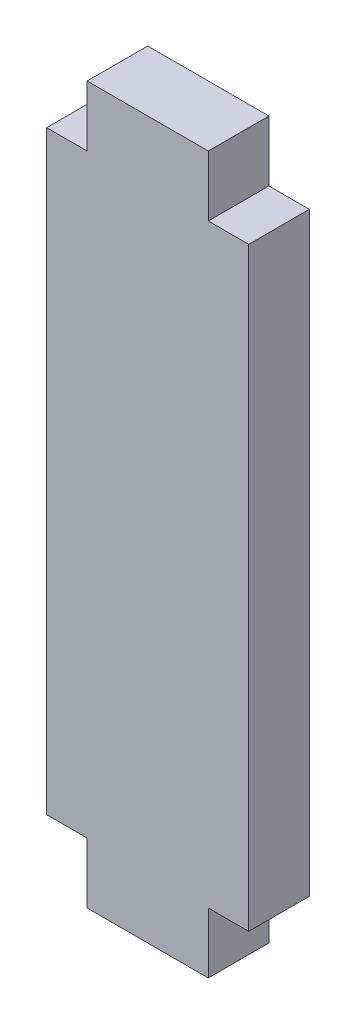
ISO-10303-21;
HEADER;
FILE_DESCRIPTION(('STEP AP214'),'2;1');
FILE_NAME('part.step','',(''),(''),'','','');
FILE_SCHEMA(('AUTOMOTIVE_DESIGN { 1 0 10303 214 1 1 1 1 }'));
ENDSEC;
DATA;
#1=APPLICATION_CONTEXT('core data for automotive mechanical design processes');
#2=APPLICATION_PROTOCOL_DEFINITION('international standard','automotive_design',2000,#1);
#3=PRODUCT_CONTEXT('',#1,'mechanical');
#4=PRODUCT('Part','Part','',(#3));
#5=PRODUCT_RELATED_PRODUCT_CATEGORY('part','',(#4));
#6=PRODUCT_DEFINITION_FORMATION('','',#4);
#7=PRODUCT_DEFINITION_CONTEXT('part definition',#1,'design');
#8=PRODUCT_DEFINITION('design','',#6,#7);
#9=PRODUCT_DEFINITION_SHAPE('','',#8);
#10=(LENGTH_UNIT() NAMED_UNIT(*) SI_UNIT(.MILLI.,.METRE.));
#11=(NAMED_UNIT(*) PLANE_ANGLE_UNIT() SI_UNIT($,.RADIAN.));
#12=(NAMED_UNIT(*) SI_UNIT($,.STERADIAN.) SOLID_ANGLE_UNIT());
#13=UNCERTAINTY_MEASURE_WITH_UNIT(LENGTH_MEASURE(1.E-05),#10,'distance_accuracy_value','');
#14=(GEOMETRIC_REPRESENTATION_CONTEXT(3) GLOBAL_UNCERTAINTY_ASSIGNED_CONTEXT((#13)) GLOBAL_UNIT_ASSIGNED_CONTEXT((#10,
#11,#12)) REPRESENTATION_CONTEXT('',''));
#15=CARTESIAN_POINT('',(0.,0.,0.));
#16=DIRECTION('',(0.,0.,1.));
#17=DIRECTION('',(1.,0.,0.));
#18=AXIS2_PLACEMENT_3D('',#15,#16,#17);
#19=CARTESIAN_POINT('',(-5.,0.,3.));
#20=DIRECTION('',(-1.,0.,0.));
#21=DIRECTION('',(0.,-1.,0.));
#22=AXIS2_PLACEMENT_3D('',#19,#20,#21);
#23=PLANE('',#22);
#24=DIRECTION('',(0.,1.,0.));
#25=VECTOR('',#24,1.);
#26=CARTESIAN_POINT('',(-5.,0.,0.));
#27=LINE('',#26,#25);
#28=CARTESIAN_POINT('',(-5.,-14.725,0.));
#29=VERTEX_POINT('',#28);
#30=CARTESIAN_POINT('',(-5.,14.725,0.));
#31=VERTEX_POINT('',#30);
#32=EDGE_CURVE('E158',#29,#31,#27,.T.);
#33=ORIENTED_EDGE('',*,*,#32,.F.);
#34=DIRECTION('',(0.,0.,-1.));
#35=VECTOR('',#34,1.);
#36=CARTESIAN_POINT('',(-5.,-14.725,3.));
#37=LINE('',#36,#35);
#38=CARTESIAN_POINT('',(-5.,-14.725,3.));
#39=VERTEX_POINT('',#38);
#40=EDGE_CURVE('E11',#39,#29,#37,.T.);
#41=ORIENTED_EDGE('',*,*,#40,.F.);
#42=DIRECTION('',(0.,1.,0.));
#43=VECTOR('',#42,1.);
#44=CARTESIAN_POINT('',(-5.,0.,3.));
#45=LINE('',#44,#43);
#46=CARTESIAN_POINT('',(-5.,14.725,3.));
#47=VERTEX_POINT('',#46);
#48=EDGE_CURVE('E216',#39,#47,#45,.T.);
#49=ORIENTED_EDGE('',*,*,#48,.T.);
#50=DIRECTION('',(0.,0.,-1.));
#51=VECTOR('',#50,1.);
#52=CARTESIAN_POINT('',(-5.,14.725,3.));
#53=LINE('',#52,#51);
#54=EDGE_CURVE('E103',#47,#31,#53,.T.);
#55=ORIENTED_EDGE('',*,*,#54,.T.);
#56=EDGE_LOOP('',(#33,#41,#49,#55));
#57=FACE_BOUND('',#56,.T.);
#58=ADVANCED_FACE('F41',(#57),#23,.T.);
#59=CARTESIAN_POINT('',(0.,-14.725,3.));
#60=DIRECTION('',(0.,-1.,0.));
#61=DIRECTION('',(1.,0.,0.));
#62=AXIS2_PLACEMENT_3D('',#59,#60,#61);
#63=PLANE('',#62);
#64=DIRECTION('',(-1.,0.,0.));
#65=VECTOR('',#64,1.);
#66=CARTESIAN_POINT('',(0.,-14.725,0.));
#67=LINE('',#66,#65);
#68=CARTESIAN_POINT('',(-3.,-14.725,0.));
#69=VERTEX_POINT('',#68);
#70=EDGE_CURVE('E161',#69,#29,#67,.T.);
#71=ORIENTED_EDGE('',*,*,#70,.F.);
#72=DIRECTION('',(0.,0.,-1.));
#73=VECTOR('',#72,1.);
#74=CARTESIAN_POINT('',(-3.,-14.725,3.));
#75=LINE('',#74,#73);
#76=CARTESIAN_POINT('',(-3.,-14.725,3.));
#77=VERTEX_POINT('',#76);
#78=EDGE_CURVE('E49',#77,#69,#75,.T.);
#79=ORIENTED_EDGE('',*,*,#78,.F.);
#80=DIRECTION('',(-1.,0.,0.));
#81=VECTOR('',#80,1.);
#82=CARTESIAN_POINT('',(0.,-14.725,3.));
#83=LINE('',#82,#81);
#84=EDGE_CURVE('E215',#77,#39,#83,.T.);
#85=ORIENTED_EDGE('',*,*,#84,.T.);
#86=ORIENTED_EDGE('',*,*,#40,.T.);
#87=EDGE_LOOP('',(#71,#79,#85,#86));
#88=FACE_BOUND('',#87,.T.);
#89=ADVANCED_FACE('F214',(#88),#63,.T.);
#90=CARTESIAN_POINT('',(-3.,0.,3.));
#91=DIRECTION('',(1.,0.,0.));
#92=DIRECTION('',(0.,0.,-1.));
#93=AXIS2_PLACEMENT_3D('',#90,#91,#92);
#94=PLANE('',#93);
#95=DIRECTION('',(0.,-1.,0.));
#96=VECTOR('',#95,1.);
#97=CARTESIAN_POINT('',(-3.,0.,0.));
#98=LINE('',#97,#96);
#99=CARTESIAN_POINT('',(-3.,-17.725,0.));
#100=VERTEX_POINT('',#99);
#101=EDGE_CURVE('E164',#69,#100,#98,.T.);
#102=ORIENTED_EDGE('',*,*,#101,.T.);
#103=DIRECTION('',(0.,0.,-1.));
#104=VECTOR('',#103,1.);
#105=CARTESIAN_POINT('',(-3.,-17.725,3.));
#106=LINE('',#105,#104);
#107=CARTESIAN_POINT('',(-3.,-17.725,3.));
#108=VERTEX_POINT('',#107);
#109=EDGE_CURVE('E199',#108,#100,#106,.T.);
#110=ORIENTED_EDGE('',*,*,#109,.F.);
#111=DIRECTION('',(0.,-1.,0.));
#112=VECTOR('',#111,1.);
#113=CARTESIAN_POINT('',(-3.,0.,3.));
#114=LINE('',#113,#112);
#115=EDGE_CURVE('E206',#77,#108,#114,.T.);
#116=ORIENTED_EDGE('',*,*,#115,.F.);
#117=ORIENTED_EDGE('',*,*,#78,.T.);
#118=EDGE_LOOP('',(#102,#110,#116,#117));
#119=FACE_BOUND('',#118,.T.);
#120=ADVANCED_FACE('F204',(#119),#94,.F.);
#121=CARTESIAN_POINT('',(0.,-17.725,3.));
#122=DIRECTION('',(0.,1.,0.));
#123=DIRECTION('',(0.,0.,1.));
#124=AXIS2_PLACEMENT_3D('',#121,#122,#123);
#125=PLANE('',#124);
#126=DIRECTION('',(1.,0.,0.));
#127=VECTOR('',#126,1.);
#128=CARTESIAN_POINT('',(0.,-17.725,0.));
#129=LINE('',#128,#127);
#130=CARTESIAN_POINT('',(3.,-17.725,0.));
#131=VERTEX_POINT('',#130);
#132=EDGE_CURVE('E167',#100,#131,#129,.T.);
#133=ORIENTED_EDGE('',*,*,#132,.T.);
#134=DIRECTION('',(0.,0.,-1.));
#135=VECTOR('',#134,1.);
#136=CARTESIAN_POINT('',(3.,-17.725,3.));
#137=LINE('',#136,#135);
#138=CARTESIAN_POINT('',(3.,-17.725,3.));
#139=VERTEX_POINT('',#138);
#140=EDGE_CURVE('E197',#139,#131,#137,.T.);
#141=ORIENTED_EDGE('',*,*,#140,.F.);
#142=DIRECTION('',(1.,0.,0.));
#143=VECTOR('',#142,1.);
#144=CARTESIAN_POINT('',(0.,-17.725,3.));
#145=LINE('',#144,#143);
#146=EDGE_CURVE('E222',#108,#139,#145,.T.);
#147=ORIENTED_EDGE('',*,*,#146,.F.);
#148=ORIENTED_EDGE('',*,*,#109,.T.);
#149=EDGE_LOOP('',(#133,#141,#147,#148));
#150=FACE_BOUND('',#149,.T.);
#151=ADVANCED_FACE('F253',(#150),#125,.F.);
#152=CARTESIAN_POINT('',(3.,0.,3.));
#153=DIRECTION('',(1.,0.,0.));
#154=DIRECTION('',(0.,1.,0.));
#155=AXIS2_PLACEMENT_3D('',#152,#153,#154);
#156=PLANE('',#155);
#157=DIRECTION('',(0.,-1.,0.));
#158=VECTOR('',#157,1.);
#159=CARTESIAN_POINT('',(3.,0.,0.));
#160=LINE('',#159,#158);
#161=CARTESIAN_POINT('',(3.,-14.725,0.));
#162=VERTEX_POINT('',#161);
#163=EDGE_CURVE('E170',#162,#131,#160,.T.);
#164=ORIENTED_EDGE('',*,*,#163,.F.);
#165=DIRECTION('',(0.,0.,-1.));
#166=VECTOR('',#165,1.);
#167=CARTESIAN_POINT('',(3.,-14.725,3.));
#168=LINE('',#167,#166);
#169=CARTESIAN_POINT('',(3.,-14.725,3.));
#170=VERTEX_POINT('',#169);
#171=EDGE_CURVE('E195',#170,#162,#168,.T.);
#172=ORIENTED_EDGE('',*,*,#171,.F.);
#173=DIRECTION('',(0.,-1.,0.));
#174=VECTOR('',#173,1.);
#175=CARTESIAN_POINT('',(3.,0.,3.));
#176=LINE('',#175,#174);
#177=EDGE_CURVE('E224',#170,#139,#176,.T.);
#178=ORIENTED_EDGE('',*,*,#177,.T.);
#179=ORIENTED_EDGE('',*,*,#140,.T.);
#180=EDGE_LOOP('',(#164,#172,#178,#179));
#181=FACE_BOUND('',#180,.T.);
#182=ADVANCED_FACE('F249',(#181),#156,.T.);
#183=CARTESIAN_POINT('',(5.,-14.725,0.));
#184=VERTEX_POINT('',#183);
#185=EDGE_CURVE('E165',#184,#162,#67,.T.);
#186=ORIENTED_EDGE('',*,*,#185,.F.);
#187=DIRECTION('',(0.,0.,-1.));
#188=VECTOR('',#187,1.);
#189=CARTESIAN_POINT('',(5.,-14.725,3.));
#190=LINE('',#189,#188);
#191=CARTESIAN_POINT('',(5.,-14.725,3.));
#192=VERTEX_POINT('',#191);
#193=EDGE_CURVE('E193',#192,#184,#190,.T.);
#194=ORIENTED_EDGE('',*,*,#193,.F.);
#195=EDGE_CURVE('E219',#192,#170,#83,.T.);
#196=ORIENTED_EDGE('',*,*,#195,.T.);
#197=ORIENTED_EDGE('',*,*,#171,.T.);
#198=EDGE_LOOP('',(#186,#194,#196,#197));
#199=FACE_BOUND('',#198,.T.);
#200=ADVANCED_FACE('F244',(#199),#63,.T.);
#201=CARTESIAN_POINT('',(5.,0.,3.));
#202=DIRECTION('',(-1.,0.,0.));
#203=DIRECTION('',(0.,-1.,0.));
#204=AXIS2_PLACEMENT_3D('',#201,#202,#203);
#205=PLANE('',#204);
#206=DIRECTION('',(0.,1.,0.));
#207=VECTOR('',#206,1.);
#208=CARTESIAN_POINT('',(5.,0.,0.));
#209=LINE('',#208,#207);
#210=CARTESIAN_POINT('',(5.,14.725,0.));
#211=VERTEX_POINT('',#210);
#212=EDGE_CURVE('E173',#184,#211,#209,.T.);
#213=ORIENTED_EDGE('',*,*,#212,.T.);
#214=DIRECTION('',(0.,0.,-1.));
#215=VECTOR('',#214,1.);
#216=CARTESIAN_POINT('',(5.,14.725,3.));
#217=LINE('',#216,#215);
#218=CARTESIAN_POINT('',(5.,14.725,3.));
#219=VERTEX_POINT('',#218);
#220=EDGE_CURVE('E190',#219,#211,#217,.T.);
#221=ORIENTED_EDGE('',*,*,#220,.F.);
#222=DIRECTION('',(0.,1.,0.));
#223=VECTOR('',#222,1.);
#224=CARTESIAN_POINT('',(5.,0.,3.));
#225=LINE('',#224,#223);
#226=EDGE_CURVE('E227',#192,#219,#225,.T.);
#227=ORIENTED_EDGE('',*,*,#226,.F.);
#228=ORIENTED_EDGE('',*,*,#193,.T.);
#229=EDGE_LOOP('',(#213,#221,#227,#228));
#230=FACE_BOUND('',#229,.T.);
#231=ADVANCED_FACE('F270',(#230),#205,.F.);
#232=CARTESIAN_POINT('',(0.,14.725,3.));
#233=DIRECTION('',(0.,-1.,0.));
#234=DIRECTION('',(1.,0.,0.));
#235=AXIS2_PLACEMENT_3D('',#232,#233,#234);
#236=PLANE('',#235);
#237=DIRECTION('',(-1.,0.,0.));
#238=VECTOR('',#237,1.);
#239=CARTESIAN_POINT('',(0.,14.725,0.));
#240=LINE('',#239,#238);
#241=CARTESIAN_POINT('',(3.,14.725,0.));
#242=VERTEX_POINT('',#241);
#243=EDGE_CURVE('E175',#211,#242,#240,.T.);
#244=ORIENTED_EDGE('',*,*,#243,.T.);
#245=DIRECTION('',(0.,0.,-1.));
#246=VECTOR('',#245,1.);
#247=CARTESIAN_POINT('',(3.,14.725,3.));
#248=LINE('',#247,#246);
#249=CARTESIAN_POINT('',(3.,14.725,3.));
#250=VERTEX_POINT('',#249);
#251=EDGE_CURVE('E187',#250,#242,#248,.T.);
#252=ORIENTED_EDGE('',*,*,#251,.F.);
#253=DIRECTION('',(-1.,0.,0.));
#254=VECTOR('',#253,1.);
#255=CARTESIAN_POINT('',(0.,14.725,3.));
#256=LINE('',#255,#254);
#257=EDGE_CURVE('E155',#219,#250,#256,.T.);
#258=ORIENTED_EDGE('',*,*,#257,.F.);
#259=ORIENTED_EDGE('',*,*,#220,.T.);
#260=EDGE_LOOP('',(#244,#252,#258,#259));
#261=FACE_BOUND('',#260,.T.);
#262=ADVANCED_FACE('F234',(#261),#236,.F.);
#263=CARTESIAN_POINT('',(3.,0.,3.));
#264=DIRECTION('',(-1.,0.,0.));
#265=DIRECTION('',(0.,-1.,0.));
#266=AXIS2_PLACEMENT_3D('',#263,#264,#265);
#267=PLANE('',#266);
#268=DIRECTION('',(0.,1.,0.));
#269=VECTOR('',#268,1.);
#270=CARTESIAN_POINT('',(3.,0.,0.));
#271=LINE('',#270,#269);
#272=CARTESIAN_POINT('',(3.,17.725,0.));
#273=VERTEX_POINT('',#272);
#274=EDGE_CURVE('E177',#242,#273,#271,.T.);
#275=ORIENTED_EDGE('',*,*,#274,.T.);
#276=DIRECTION('',(0.,0.,-1.));
#277=VECTOR('',#276,1.);
#278=CARTESIAN_POINT('',(3.,17.725,3.));
#279=LINE('',#278,#277);
#280=CARTESIAN_POINT('',(3.,17.725,3.));
#281=VERTEX_POINT('',#280);
#282=EDGE_CURVE('E144',#281,#273,#279,.T.);
#283=ORIENTED_EDGE('',*,*,#282,.F.);
#284=DIRECTION('',(0.,1.,0.));
#285=VECTOR('',#284,1.);
#286=CARTESIAN_POINT('',(3.,0.,3.));
#287=LINE('',#286,#285);
#288=EDGE_CURVE('E149',#250,#281,#287,.T.);
#289=ORIENTED_EDGE('',*,*,#288,.F.);
#290=ORIENTED_EDGE('',*,*,#251,.T.);
#291=EDGE_LOOP('',(#275,#283,#289,#290));
#292=FACE_BOUND('',#291,.T.);
#293=ADVANCED_FACE('F238',(#292),#267,.F.);
#294=CARTESIAN_POINT('',(0.,17.725,3.));
#295=DIRECTION('',(0.,1.,0.));
#296=DIRECTION('',(-1.,0.,0.));
#297=AXIS2_PLACEMENT_3D('',#294,#295,#296);
#298=PLANE('',#297);
#299=DIRECTION('',(1.,0.,0.));
#300=VECTOR('',#299,1.);
#301=CARTESIAN_POINT('',(0.,17.725,0.));
#302=LINE('',#301,#300);
#303=CARTESIAN_POINT('',(-3.,17.725,0.));
#304=VERTEX_POINT('',#303);
#305=EDGE_CURVE('E139',#304,#273,#302,.T.);
#306=ORIENTED_EDGE('',*,*,#305,.F.);
#307=DIRECTION('',(0.,0.,-1.));
#308=VECTOR('',#307,1.);
#309=CARTESIAN_POINT('',(-3.,17.725,3.));
#310=LINE('',#309,#308);
#311=CARTESIAN_POINT('',(-3.,17.725,3.));
#312=VERTEX_POINT('',#311);
#313=EDGE_CURVE('E134',#312,#304,#310,.T.);
#314=ORIENTED_EDGE('',*,*,#313,.F.);
#315=DIRECTION('',(1.,0.,0.));
#316=VECTOR('',#315,1.);
#317=CARTESIAN_POINT('',(0.,17.725,3.));
#318=LINE('',#317,#316);
#319=EDGE_CURVE('E137',#312,#281,#318,.T.);
#320=ORIENTED_EDGE('',*,*,#319,.T.);
#321=ORIENTED_EDGE('',*,*,#282,.T.);
#322=EDGE_LOOP('',(#306,#314,#320,#321));
#323=FACE_BOUND('',#322,.T.);
#324=ADVANCED_FACE('F136',(#323),#298,.T.);
#325=CARTESIAN_POINT('',(-3.,0.,3.));
#326=DIRECTION('',(-1.,0.,0.));
#327=DIRECTION('',(0.,0.,1.));
#328=AXIS2_PLACEMENT_3D('',#325,#326,#327);
#329=PLANE('',#328);
#330=DIRECTION('',(0.,1.,0.));
#331=VECTOR('',#330,1.);
#332=CARTESIAN_POINT('',(-3.,0.,0.));
#333=LINE('',#332,#331);
#334=CARTESIAN_POINT('',(-3.,14.725,0.));
#335=VERTEX_POINT('',#334);
#336=EDGE_CURVE('E182',#335,#304,#333,.T.);
#337=ORIENTED_EDGE('',*,*,#336,.F.);
#338=DIRECTION('',(0.,0.,-1.));
#339=VECTOR('',#338,1.);
#340=CARTESIAN_POINT('',(-3.,14.725,3.));
#341=LINE('',#340,#339);
#342=CARTESIAN_POINT('',(-3.,14.725,3.));
#343=VERTEX_POINT('',#342);
#344=EDGE_CURVE('E96',#343,#335,#341,.T.);
#345=ORIENTED_EDGE('',*,*,#344,.F.);
#346=DIRECTION('',(0.,1.,0.));
#347=VECTOR('',#346,1.);
#348=CARTESIAN_POINT('',(-3.,0.,3.));
#349=LINE('',#348,#347);
#350=EDGE_CURVE('E147',#343,#312,#349,.T.);
#351=ORIENTED_EDGE('',*,*,#350,.T.);
#352=ORIENTED_EDGE('',*,*,#313,.T.);
#353=EDGE_LOOP('',(#337,#345,#351,#352));
#354=FACE_BOUND('',#353,.T.);
#355=ADVANCED_FACE('F152',(#354),#329,.T.);
#356=EDGE_CURVE('E178',#335,#31,#240,.T.);
#357=ORIENTED_EDGE('',*,*,#356,.T.);
#358=ORIENTED_EDGE('',*,*,#54,.F.);
#359=EDGE_CURVE('E57',#343,#47,#256,.T.);
#360=ORIENTED_EDGE('',*,*,#359,.F.);
#361=ORIENTED_EDGE('',*,*,#344,.T.);
#362=EDGE_LOOP('',(#357,#358,#360,#361));
#363=FACE_BOUND('',#362,.T.);
#364=ADVANCED_FACE('F278',(#363),#236,.F.);
#365=CARTESIAN_POINT('',(0.,0.,3.));
#366=DIRECTION('',(0.,0.,1.));
#367=DIRECTION('',(1.,0.,0.));
#368=AXIS2_PLACEMENT_3D('',#365,#366,#367);
#369=PLANE('',#368);
#370=ORIENTED_EDGE('',*,*,#48,.F.);
#371=ORIENTED_EDGE('',*,*,#84,.F.);
#372=ORIENTED_EDGE('',*,*,#115,.T.);
#373=ORIENTED_EDGE('',*,*,#146,.T.);
#374=ORIENTED_EDGE('',*,*,#177,.F.);
#375=ORIENTED_EDGE('',*,*,#195,.F.);
#376=ORIENTED_EDGE('',*,*,#226,.T.);
#377=ORIENTED_EDGE('',*,*,#257,.T.);
#378=ORIENTED_EDGE('',*,*,#288,.T.);
#379=ORIENTED_EDGE('',*,*,#319,.F.);
#380=ORIENTED_EDGE('',*,*,#350,.F.);
#381=ORIENTED_EDGE('',*,*,#359,.T.);
#382=EDGE_LOOP('',(#370,#371,#372,#373,#374,#375,#376,#377,#378,#379,#380,#381));
#383=FACE_BOUND('',#382,.T.);
#384=ADVANCED_FACE('F146',(#383),#369,.T.);
#385=CARTESIAN_POINT('',(0.,0.,0.));
#386=DIRECTION('',(0.,0.,1.));
#387=DIRECTION('',(1.,0.,0.));
#388=AXIS2_PLACEMENT_3D('',#385,#386,#387);
#389=PLANE('',#388);
#390=ORIENTED_EDGE('',*,*,#32,.T.);
#391=ORIENTED_EDGE('',*,*,#356,.F.);
#392=ORIENTED_EDGE('',*,*,#336,.T.);
#393=ORIENTED_EDGE('',*,*,#305,.T.);
#394=ORIENTED_EDGE('',*,*,#274,.F.);
#395=ORIENTED_EDGE('',*,*,#243,.F.);
#396=ORIENTED_EDGE('',*,*,#212,.F.);
#397=ORIENTED_EDGE('',*,*,#185,.T.);
#398=ORIENTED_EDGE('',*,*,#163,.T.);
#399=ORIENTED_EDGE('',*,*,#132,.F.);
#400=ORIENTED_EDGE('',*,*,#101,.F.);
#401=ORIENTED_EDGE('',*,*,#70,.T.);
#402=EDGE_LOOP('',(#390,#391,#392,#393,#394,#395,#396,#397,#398,#399,#400,#401));
#403=FACE_BOUND('',#402,.T.);
#404=ADVANCED_FACE('F213',(#403),#389,.F.);
#405=CLOSED_SHELL('',(#58,#89,#120,#151,#182,#200,#231,#262,#293,#324,#355,#364,#384,#404));
#406=MANIFOLD_SOLID_BREP('B2',#405);
#407=ADVANCED_BREP_SHAPE_REPRESENTATION('',(#18,#406),#14);
#408=SHAPE_DEFINITION_REPRESENTATION(#9,#407);
ENDSEC;
END-ISO-10303-21;
